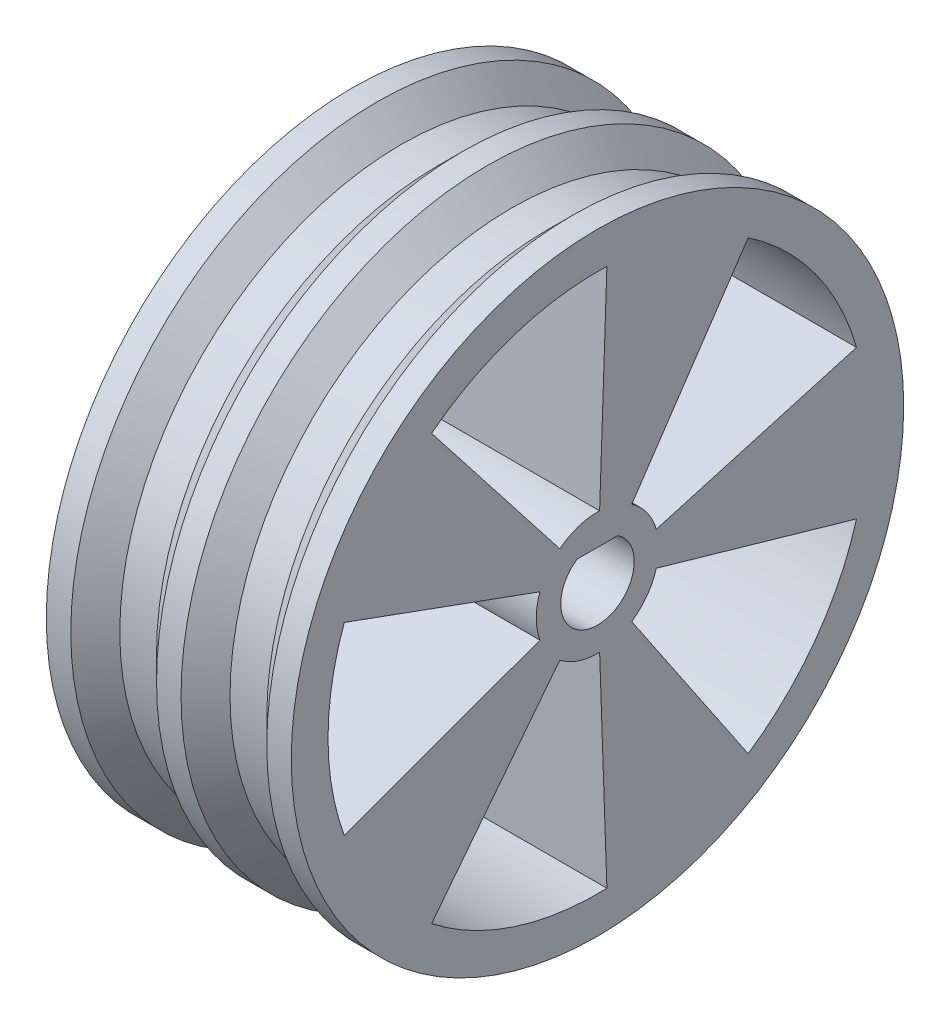
ISO-10303-21;
HEADER;
FILE_DESCRIPTION(('STEP AP214'),'2;1');
FILE_NAME('part.step','',(''),(''),'','','');
FILE_SCHEMA(('AUTOMOTIVE_DESIGN { 1 0 10303 214 1 1 1 1 }'));
ENDSEC;
DATA;
#1=APPLICATION_CONTEXT('core data for automotive mechanical design processes');
#2=APPLICATION_PROTOCOL_DEFINITION('international standard','automotive_design',2000,#1);
#3=PRODUCT_CONTEXT('',#1,'mechanical');
#4=PRODUCT('Part','Part','',(#3));
#5=PRODUCT_RELATED_PRODUCT_CATEGORY('part','',(#4));
#6=PRODUCT_DEFINITION_FORMATION('','',#4);
#7=PRODUCT_DEFINITION_CONTEXT('part definition',#1,'design');
#8=PRODUCT_DEFINITION('design','',#6,#7);
#9=PRODUCT_DEFINITION_SHAPE('','',#8);
#10=(LENGTH_UNIT() NAMED_UNIT(*) SI_UNIT(.MILLI.,.METRE.));
#11=(NAMED_UNIT(*) PLANE_ANGLE_UNIT() SI_UNIT($,.RADIAN.));
#12=(NAMED_UNIT(*) SI_UNIT($,.STERADIAN.) SOLID_ANGLE_UNIT());
#13=UNCERTAINTY_MEASURE_WITH_UNIT(LENGTH_MEASURE(1.E-05),#10,'distance_accuracy_value','');
#14=(GEOMETRIC_REPRESENTATION_CONTEXT(3) GLOBAL_UNCERTAINTY_ASSIGNED_CONTEXT((#13)) GLOBAL_UNIT_ASSIGNED_CONTEXT((#10,
#11,#12)) REPRESENTATION_CONTEXT('',''));
#15=CARTESIAN_POINT('',(0.,0.,0.));
#16=DIRECTION('',(0.,0.,1.));
#17=DIRECTION('',(1.,0.,0.));
#18=AXIS2_PLACEMENT_3D('',#15,#16,#17);
#19=CARTESIAN_POINT('',(-10.,2.5,1.6583123951777));
#20=DIRECTION('',(0.,1.,0.));
#21=DIRECTION('',(0.,0.,1.));
#22=AXIS2_PLACEMENT_3D('',#19,#20,#21);
#23=PLANE('',#22);
#24=DIRECTION('',(0.,0.,1.));
#25=VECTOR('',#24,1.);
#26=CARTESIAN_POINT('',(-6.,2.5,1.6583123951777));
#27=LINE('',#26,#25);
#28=CARTESIAN_POINT('',(-6.,2.5,-1.6583123951777));
#29=VERTEX_POINT('',#28);
#30=CARTESIAN_POINT('',(-6.,2.5,1.6583123951777));
#31=VERTEX_POINT('',#30);
#32=EDGE_CURVE('E227',#29,#31,#27,.T.);
#33=ORIENTED_EDGE('',*,*,#32,.F.);
#34=DIRECTION('',(1.,0.,0.));
#35=VECTOR('',#34,1.);
#36=CARTESIAN_POINT('',(-10.,2.5,-1.6583123951777));
#37=LINE('',#36,#35);
#38=CARTESIAN_POINT('',(10.,2.5,-1.6583123951777));
#39=VERTEX_POINT('',#38);
#40=EDGE_CURVE('E241',#29,#39,#37,.T.);
#41=ORIENTED_EDGE('',*,*,#40,.T.);
#42=DIRECTION('',(0.,0.,1.));
#43=VECTOR('',#42,1.);
#44=CARTESIAN_POINT('',(10.,2.5,1.6583123951777));
#45=LINE('',#44,#43);
#46=CARTESIAN_POINT('',(10.,2.5,1.6583123951777));
#47=VERTEX_POINT('',#46);
#48=EDGE_CURVE('E245',#39,#47,#45,.T.);
#49=ORIENTED_EDGE('',*,*,#48,.T.);
#50=DIRECTION('',(1.,0.,0.));
#51=VECTOR('',#50,1.);
#52=CARTESIAN_POINT('',(-10.,2.5,1.6583123951777));
#53=LINE('',#52,#51);
#54=EDGE_CURVE('E239',#31,#47,#53,.T.);
#55=ORIENTED_EDGE('',*,*,#54,.F.);
#56=EDGE_LOOP('',(#33,#41,#49,#55));
#57=FACE_BOUND('',#56,.T.);
#58=ADVANCED_FACE('F81',(#57),#23,.F.);
#59=CARTESIAN_POINT('',(-10.,0.,0.));
#60=DIRECTION('',(1.,0.,0.));
#61=DIRECTION('',(0.,0.,-1.));
#62=AXIS2_PLACEMENT_3D('',#59,#60,#61);
#63=PLANE('',#62);
#64=CARTESIAN_POINT('',(-10.,0.,0.));
#65=DIRECTION('',(1.,0.,0.));
#66=DIRECTION('',(0.,0.,-1.));
#67=AXIS2_PLACEMENT_3D('',#64,#65,#66);
#68=CIRCLE('',#67,5.);
#69=CARTESIAN_POINT('',(-10.,-4.99695413509548,-0.174497483512452));
#70=VERTEX_POINT('',#69);
#71=CARTESIAN_POINT('',(-10.,-3.94005376803357,3.07830737662834));
#72=VERTEX_POINT('',#71);
#73=EDGE_CURVE('E798',#70,#72,#68,.F.);
#74=ORIENTED_EDGE('',*,*,#73,.T.);
#75=DIRECTION('',(0.,0.788010753606723,-0.615661475325657));
#76=VECTOR('',#75,1.);
#77=CARTESIAN_POINT('',(-10.,0.,0.));
#78=LINE('',#77,#76);
#79=CARTESIAN_POINT('',(-10.,-17.3362365793479,13.5445524571645));
#80=VERTEX_POINT('',#79);
#81=EDGE_CURVE('E779',#80,#72,#78,.T.);
#82=ORIENTED_EDGE('',*,*,#81,.F.);
#83=CARTESIAN_POINT('',(-10.,0.,0.));
#84=DIRECTION('',(1.,0.,0.));
#85=DIRECTION('',(0.,0.,-1.));
#86=AXIS2_PLACEMENT_3D('',#83,#84,#85);
#87=CIRCLE('',#86,22.);
#88=CARTESIAN_POINT('',(-10.,-21.9865981944201,-0.767788927455052));
#89=VERTEX_POINT('',#88);
#90=EDGE_CURVE('E771',#89,#80,#87,.F.);
#91=ORIENTED_EDGE('',*,*,#90,.F.);
#92=DIRECTION('',(0.,0.999390827019096,0.0348994967025059));
#93=VECTOR('',#92,1.);
#94=CARTESIAN_POINT('',(-10.,0.,0.));
#95=LINE('',#94,#93);
#96=EDGE_CURVE('E789',#89,#70,#95,.T.);
#97=ORIENTED_EDGE('',*,*,#96,.T.);
#98=EDGE_LOOP('',(#74,#82,#91,#97));
#99=FACE_BOUND('',#98,.T.);
#100=CARTESIAN_POINT('',(-10.,0.,0.));
#101=DIRECTION('',(1.,0.,0.));
#102=DIRECTION('',(0.,0.,-1.));
#103=AXIS2_PLACEMENT_3D('',#100,#101,#102);
#104=CIRCLE('',#103,5.);
#105=CARTESIAN_POINT('',(-10.,-1.37818677908506,-4.8063084796917));
#106=VERTEX_POINT('',#105);
#107=CARTESIAN_POINT('',(-10.,-4.14518786277518,-2.79596451735377));
#108=VERTEX_POINT('',#107);
#109=EDGE_CURVE('E773',#106,#108,#104,.F.);
#110=ORIENTED_EDGE('',*,*,#109,.T.);
#111=DIRECTION('',(0.,0.829037572555044,0.559192903470743));
#112=VECTOR('',#111,1.);
#113=CARTESIAN_POINT('',(-10.,0.,0.));
#114=LINE('',#113,#112);
#115=CARTESIAN_POINT('',(-10.,-18.2388265962109,-12.3022438763564));
#116=VERTEX_POINT('',#115);
#117=EDGE_CURVE('E751',#116,#108,#114,.T.);
#118=ORIENTED_EDGE('',*,*,#117,.F.);
#119=CARTESIAN_POINT('',(-10.,0.,0.));
#120=DIRECTION('',(1.,0.,0.));
#121=DIRECTION('',(0.,0.,-1.));
#122=AXIS2_PLACEMENT_3D('',#119,#120,#121);
#123=CIRCLE('',#122,22.);
#124=CARTESIAN_POINT('',(-10.,-6.06402182797396,-21.147757310643));
#125=VERTEX_POINT('',#124);
#126=EDGE_CURVE('E743',#125,#116,#123,.F.);
#127=ORIENTED_EDGE('',*,*,#126,.F.);
#128=DIRECTION('',(0.,0.275637355816996,0.96126169593832));
#129=VECTOR('',#128,1.);
#130=CARTESIAN_POINT('',(-10.,0.,0.));
#131=LINE('',#130,#129);
#132=EDGE_CURVE('E762',#125,#106,#131,.T.);
#133=ORIENTED_EDGE('',*,*,#132,.T.);
#134=EDGE_LOOP('',(#110,#118,#127,#133));
#135=FACE_BOUND('',#134,.T.);
#136=CARTESIAN_POINT('',(-10.,0.,0.));
#137=DIRECTION('',(1.,0.,0.));
#138=DIRECTION('',(0.,0.,-1.));
#139=AXIS2_PLACEMENT_3D('',#136,#137,#138);
#140=CIRCLE('',#139,5.);
#141=CARTESIAN_POINT('',(-10.,4.14518786277522,-2.79596451735385));
#142=VERTEX_POINT('',#141);
#143=CARTESIAN_POINT('',(-10.,1.37818677908497,-4.8063084796916));
#144=VERTEX_POINT('',#143);
#145=EDGE_CURVE('E745',#142,#144,#140,.F.);
#146=ORIENTED_EDGE('',*,*,#145,.T.);
#147=DIRECTION('',(0.,-0.275637355816999,0.961261695938319));
#148=VECTOR('',#147,1.);
#149=CARTESIAN_POINT('',(-10.,0.,0.));
#150=LINE('',#149,#148);
#151=CARTESIAN_POINT('',(-10.,6.06402182797396,-21.147757310643));
#152=VERTEX_POINT('',#151);
#153=EDGE_CURVE('E723',#152,#144,#150,.T.);
#154=ORIENTED_EDGE('',*,*,#153,.F.);
#155=CARTESIAN_POINT('',(-10.,0.,0.));
#156=DIRECTION('',(1.,0.,0.));
#157=DIRECTION('',(0.,0.,-1.));
#158=AXIS2_PLACEMENT_3D('',#155,#156,#157);
#159=CIRCLE('',#158,22.);
#160=CARTESIAN_POINT('',(-10.,18.2388265962109,-12.3022438763564));
#161=VERTEX_POINT('',#160);
#162=EDGE_CURVE('E698',#161,#152,#159,.F.);
#163=ORIENTED_EDGE('',*,*,#162,.F.);
#164=DIRECTION('',(0.,-0.829037572555046,0.559192903470741));
#165=VECTOR('',#164,1.);
#166=CARTESIAN_POINT('',(-10.,0.,-1.04985018589199E-13));
#167=LINE('',#166,#165);
#168=EDGE_CURVE('E734',#161,#142,#167,.T.);
#169=ORIENTED_EDGE('',*,*,#168,.T.);
#170=EDGE_LOOP('',(#146,#154,#163,#169));
#171=FACE_BOUND('',#170,.T.);
#172=CARTESIAN_POINT('',(-10.,0.,0.));
#173=DIRECTION('',(1.,0.,0.));
#174=DIRECTION('',(0.,0.,-1.));
#175=AXIS2_PLACEMENT_3D('',#172,#173,#174);
#176=CIRCLE('',#175,5.);
#177=CARTESIAN_POINT('',(-10.,3.9400537680336,3.0783073766283));
#178=VERTEX_POINT('',#177);
#179=CARTESIAN_POINT('',(-10.,4.99695413509548,-0.174497483512522));
#180=VERTEX_POINT('',#179);
#181=EDGE_CURVE('E687',#178,#180,#176,.F.);
#182=ORIENTED_EDGE('',*,*,#181,.T.);
#183=DIRECTION('',(0.,-0.999390827019096,0.0348994967025015));
#184=VECTOR('',#183,1.);
#185=CARTESIAN_POINT('',(-10.,0.,0.));
#186=LINE('',#185,#184);
#187=CARTESIAN_POINT('',(-10.,21.9865981944201,-0.767788927455048));
#188=VERTEX_POINT('',#187);
#189=EDGE_CURVE('E683',#188,#180,#186,.T.);
#190=ORIENTED_EDGE('',*,*,#189,.F.);
#191=CARTESIAN_POINT('',(-10.,0.,0.));
#192=DIRECTION('',(1.,0.,0.));
#193=DIRECTION('',(0.,0.,-1.));
#194=AXIS2_PLACEMENT_3D('',#191,#192,#193);
#195=CIRCLE('',#194,22.);
#196=CARTESIAN_POINT('',(-10.,17.3362365793479,13.5445524571645));
#197=VERTEX_POINT('',#196);
#198=EDGE_CURVE('E680',#197,#188,#195,.F.);
#199=ORIENTED_EDGE('',*,*,#198,.F.);
#200=DIRECTION('',(0.,-0.788010753606721,-0.615661475325659));
#201=VECTOR('',#200,1.);
#202=CARTESIAN_POINT('',(-10.,0.,0.));
#203=LINE('',#202,#201);
#204=EDGE_CURVE('E692',#197,#178,#203,.T.);
#205=ORIENTED_EDGE('',*,*,#204,.T.);
#206=EDGE_LOOP('',(#182,#190,#199,#205));
#207=FACE_BOUND('',#206,.T.);
#208=CARTESIAN_POINT('',(-10.,0.,0.));
#209=DIRECTION('',(1.,0.,0.));
#210=DIRECTION('',(0.,0.,-1.));
#211=AXIS2_PLACEMENT_3D('',#208,#209,#210);
#212=CIRCLE('',#211,25.);
#213=CARTESIAN_POINT('',(-10.,0.,-25.));
#214=VERTEX_POINT('',#213);
#215=EDGE_CURVE('E233',#214,#214,#212,.T.);
#216=ORIENTED_EDGE('',*,*,#215,.F.);
#217=EDGE_LOOP('',(#216));
#218=FACE_BOUND('',#217,.T.);
#219=CARTESIAN_POINT('',(-10.,0.,0.));
#220=DIRECTION('',(1.,0.,0.));
#221=DIRECTION('',(0.,0.,-1.));
#222=AXIS2_PLACEMENT_3D('',#219,#220,#221);
#223=CIRCLE('',#222,3.);
#224=CARTESIAN_POINT('',(-10.,0.,-3.));
#225=VERTEX_POINT('',#224);
#226=EDGE_CURVE('E250',#225,#225,#223,.T.);
#227=ORIENTED_EDGE('',*,*,#226,.T.);
#228=EDGE_LOOP('',(#227));
#229=FACE_BOUND('',#228,.T.);
#230=DIRECTION('',(0.,0.34202014332567,-0.939692620785908));
#231=VECTOR('',#230,1.);
#232=CARTESIAN_POINT('',(-10.,0.,0.));
#233=LINE('',#232,#231);
#234=CARTESIAN_POINT('',(-10.,-7.52444315316474,20.67323765729));
#235=VERTEX_POINT('',#234);
#236=CARTESIAN_POINT('',(-10.,-1.71010071662835,4.69846310392954));
#237=VERTEX_POINT('',#236);
#238=EDGE_CURVE('E645',#235,#237,#233,.T.);
#239=ORIENTED_EDGE('',*,*,#238,.T.);
#240=CARTESIAN_POINT('',(-10.,0.,0.));
#241=DIRECTION('',(1.,0.,0.));
#242=DIRECTION('',(0.,0.,-1.));
#243=AXIS2_PLACEMENT_3D('',#240,#241,#242);
#244=CIRCLE('',#243,5.);
#245=CARTESIAN_POINT('',(-10.,1.71010071662835,4.69846310392954));
#246=VERTEX_POINT('',#245);
#247=EDGE_CURVE('E653',#237,#246,#244,.F.);
#248=ORIENTED_EDGE('',*,*,#247,.T.);
#249=DIRECTION('',(0.,-0.34202014332567,-0.939692620785908));
#250=VECTOR('',#249,1.);
#251=CARTESIAN_POINT('',(-10.,0.,0.));
#252=LINE('',#251,#250);
#253=CARTESIAN_POINT('',(-10.,7.52444315316474,20.67323765729));
#254=VERTEX_POINT('',#253);
#255=EDGE_CURVE('E676',#254,#246,#252,.T.);
#256=ORIENTED_EDGE('',*,*,#255,.F.);
#257=CARTESIAN_POINT('',(-10.,0.,0.));
#258=DIRECTION('',(1.,0.,0.));
#259=DIRECTION('',(0.,0.,-1.));
#260=AXIS2_PLACEMENT_3D('',#257,#258,#259);
#261=CIRCLE('',#260,22.);
#262=EDGE_CURVE('E660',#235,#254,#261,.F.);
#263=ORIENTED_EDGE('',*,*,#262,.F.);
#264=EDGE_LOOP('',(#239,#248,#256,#263));
#265=FACE_BOUND('',#264,.T.);
#266=ADVANCED_FACE('F274',(#99,#135,#171,#207,#218,#229,#265),#63,.F.);
#267=CARTESIAN_POINT('',(10.,0.,0.));
#268=DIRECTION('',(1.,0.,0.));
#269=DIRECTION('',(0.,0.,-1.));
#270=AXIS2_PLACEMENT_3D('',#267,#268,#269);
#271=PLANE('',#270);
#272=DIRECTION('',(0.,-0.788010753606723,0.615661475325657));
#273=VECTOR('',#272,1.);
#274=CARTESIAN_POINT('',(10.,0.,0.));
#275=LINE('',#274,#273);
#276=CARTESIAN_POINT('',(10.,-3.94005376803357,3.07830737662834));
#277=VERTEX_POINT('',#276);
#278=CARTESIAN_POINT('',(10.,-17.3362365793479,13.5445524571645));
#279=VERTEX_POINT('',#278);
#280=EDGE_CURVE('E242',#277,#279,#275,.T.);
#281=ORIENTED_EDGE('',*,*,#280,.F.);
#282=CARTESIAN_POINT('',(10.,0.,0.));
#283=DIRECTION('',(1.,0.,0.));
#284=DIRECTION('',(0.,0.,-1.));
#285=AXIS2_PLACEMENT_3D('',#282,#283,#284);
#286=CIRCLE('',#285,5.);
#287=CARTESIAN_POINT('',(10.,-4.99695413509548,-0.174497483512452));
#288=VERTEX_POINT('',#287);
#289=EDGE_CURVE('E783',#277,#288,#286,.T.);
#290=ORIENTED_EDGE('',*,*,#289,.T.);
#291=DIRECTION('',(0.,-0.999390827019096,-0.0348994967025059));
#292=VECTOR('',#291,1.);
#293=CARTESIAN_POINT('',(10.,0.,0.));
#294=LINE('',#293,#292);
#295=CARTESIAN_POINT('',(10.,-21.9865981944201,-0.767788927455052));
#296=VERTEX_POINT('',#295);
#297=EDGE_CURVE('E791',#288,#296,#294,.T.);
#298=ORIENTED_EDGE('',*,*,#297,.T.);
#299=CARTESIAN_POINT('',(10.,0.,0.));
#300=DIRECTION('',(1.,0.,0.));
#301=DIRECTION('',(0.,0.,-1.));
#302=AXIS2_PLACEMENT_3D('',#299,#300,#301);
#303=CIRCLE('',#302,22.);
#304=EDGE_CURVE('E794',#279,#296,#303,.T.);
#305=ORIENTED_EDGE('',*,*,#304,.F.);
#306=EDGE_LOOP('',(#281,#290,#298,#305));
#307=FACE_BOUND('',#306,.T.);
#308=DIRECTION('',(0.,-0.829037572555044,-0.559192903470743));
#309=VECTOR('',#308,1.);
#310=CARTESIAN_POINT('',(10.,0.,0.));
#311=LINE('',#310,#309);
#312=CARTESIAN_POINT('',(10.,-4.14518786277528,-2.79596451735384));
#313=VERTEX_POINT('',#312);
#314=CARTESIAN_POINT('',(10.,-18.2388265962109,-12.3022438763564));
#315=VERTEX_POINT('',#314);
#316=EDGE_CURVE('E609',#313,#315,#311,.T.);
#317=ORIENTED_EDGE('',*,*,#316,.F.);
#318=CARTESIAN_POINT('',(10.,0.,0.));
#319=DIRECTION('',(1.,0.,0.));
#320=DIRECTION('',(0.,0.,-1.));
#321=AXIS2_PLACEMENT_3D('',#318,#319,#320);
#322=CIRCLE('',#321,5.);
#323=CARTESIAN_POINT('',(10.,-1.37818677908506,-4.8063084796917));
#324=VERTEX_POINT('',#323);
#325=EDGE_CURVE('E756',#313,#324,#322,.T.);
#326=ORIENTED_EDGE('',*,*,#325,.T.);
#327=DIRECTION('',(0.,-0.275637355816996,-0.96126169593832));
#328=VECTOR('',#327,1.);
#329=CARTESIAN_POINT('',(10.,0.,0.));
#330=LINE('',#329,#328);
#331=CARTESIAN_POINT('',(10.,-6.06402182797396,-21.147757310643));
#332=VERTEX_POINT('',#331);
#333=EDGE_CURVE('E764',#324,#332,#330,.T.);
#334=ORIENTED_EDGE('',*,*,#333,.T.);
#335=CARTESIAN_POINT('',(10.,0.,0.));
#336=DIRECTION('',(1.,0.,0.));
#337=DIRECTION('',(0.,0.,-1.));
#338=AXIS2_PLACEMENT_3D('',#335,#336,#337);
#339=CIRCLE('',#338,22.);
#340=EDGE_CURVE('E767',#315,#332,#339,.T.);
#341=ORIENTED_EDGE('',*,*,#340,.F.);
#342=EDGE_LOOP('',(#317,#326,#334,#341));
#343=FACE_BOUND('',#342,.T.);
#344=DIRECTION('',(0.,0.275637355816999,-0.961261695938319));
#345=VECTOR('',#344,1.);
#346=CARTESIAN_POINT('',(10.,0.,0.));
#347=LINE('',#346,#345);
#348=CARTESIAN_POINT('',(10.,1.378186779085,-4.80630847969172));
#349=VERTEX_POINT('',#348);
#350=CARTESIAN_POINT('',(10.,6.06402182797396,-21.147757310643));
#351=VERTEX_POINT('',#350);
#352=EDGE_CURVE('E614',#349,#351,#347,.T.);
#353=ORIENTED_EDGE('',*,*,#352,.F.);
#354=CARTESIAN_POINT('',(10.,0.,0.));
#355=DIRECTION('',(1.,0.,0.));
#356=DIRECTION('',(0.,0.,-1.));
#357=AXIS2_PLACEMENT_3D('',#354,#355,#356);
#358=CIRCLE('',#357,5.);
#359=CARTESIAN_POINT('',(10.,4.14518786277522,-2.79596451735385));
#360=VERTEX_POINT('',#359);
#361=EDGE_CURVE('E728',#349,#360,#358,.T.);
#362=ORIENTED_EDGE('',*,*,#361,.T.);
#363=DIRECTION('',(0.,0.829037572555046,-0.559192903470741));
#364=VECTOR('',#363,1.);
#365=CARTESIAN_POINT('',(10.,0.,-1.04985018589199E-13));
#366=LINE('',#365,#364);
#367=CARTESIAN_POINT('',(10.,18.2388265962109,-12.3022438763564));
#368=VERTEX_POINT('',#367);
#369=EDGE_CURVE('E736',#360,#368,#366,.T.);
#370=ORIENTED_EDGE('',*,*,#369,.T.);
#371=CARTESIAN_POINT('',(10.,0.,0.));
#372=DIRECTION('',(1.,0.,0.));
#373=DIRECTION('',(0.,0.,-1.));
#374=AXIS2_PLACEMENT_3D('',#371,#372,#373);
#375=CIRCLE('',#374,22.);
#376=EDGE_CURVE('E739',#351,#368,#375,.T.);
#377=ORIENTED_EDGE('',*,*,#376,.F.);
#378=EDGE_LOOP('',(#353,#362,#370,#377));
#379=FACE_BOUND('',#378,.T.);
#380=DIRECTION('',(0.,0.999390827019096,-0.0348994967025015));
#381=VECTOR('',#380,1.);
#382=CARTESIAN_POINT('',(10.,0.,0.));
#383=LINE('',#382,#381);
#384=CARTESIAN_POINT('',(10.,4.99695413509548,-0.174497483512522));
#385=VERTEX_POINT('',#384);
#386=CARTESIAN_POINT('',(10.,21.9865981944201,-0.767788927455049));
#387=VERTEX_POINT('',#386);
#388=EDGE_CURVE('E619',#385,#387,#383,.T.);
#389=ORIENTED_EDGE('',*,*,#388,.F.);
#390=CARTESIAN_POINT('',(10.,0.,0.));
#391=DIRECTION('',(1.,0.,0.));
#392=DIRECTION('',(0.,0.,-1.));
#393=AXIS2_PLACEMENT_3D('',#390,#391,#392);
#394=CIRCLE('',#393,5.);
#395=CARTESIAN_POINT('',(10.,3.9400537680336,3.0783073766283));
#396=VERTEX_POINT('',#395);
#397=EDGE_CURVE('E704',#385,#396,#394,.T.);
#398=ORIENTED_EDGE('',*,*,#397,.T.);
#399=DIRECTION('',(0.,0.788010753606721,0.615661475325659));
#400=VECTOR('',#399,1.);
#401=CARTESIAN_POINT('',(10.,0.,0.));
#402=LINE('',#401,#400);
#403=CARTESIAN_POINT('',(10.,17.3362365793479,13.5445524571645));
#404=VERTEX_POINT('',#403);
#405=EDGE_CURVE('E701',#396,#404,#402,.T.);
#406=ORIENTED_EDGE('',*,*,#405,.T.);
#407=CARTESIAN_POINT('',(10.,0.,0.));
#408=DIRECTION('',(1.,0.,0.));
#409=DIRECTION('',(0.,0.,-1.));
#410=AXIS2_PLACEMENT_3D('',#407,#408,#409);
#411=CIRCLE('',#410,22.);
#412=EDGE_CURVE('E697',#387,#404,#411,.T.);
#413=ORIENTED_EDGE('',*,*,#412,.F.);
#414=EDGE_LOOP('',(#389,#398,#406,#413));
#415=FACE_BOUND('',#414,.T.);
#416=ORIENTED_EDGE('',*,*,#48,.F.);
#417=CARTESIAN_POINT('',(10.,0.,0.));
#418=DIRECTION('',(1.,0.,0.));
#419=DIRECTION('',(0.,0.,-1.));
#420=AXIS2_PLACEMENT_3D('',#417,#418,#419);
#421=CIRCLE('',#420,3.);
#422=EDGE_CURVE('E662',#47,#39,#421,.T.);
#423=ORIENTED_EDGE('',*,*,#422,.F.);
#424=EDGE_LOOP('',(#416,#423));
#425=FACE_BOUND('',#424,.T.);
#426=CARTESIAN_POINT('',(10.,0.,0.));
#427=DIRECTION('',(1.,0.,0.));
#428=DIRECTION('',(0.,0.,-1.));
#429=AXIS2_PLACEMENT_3D('',#426,#427,#428);
#430=CIRCLE('',#429,25.);
#431=CARTESIAN_POINT('',(10.,0.,-25.));
#432=VERTEX_POINT('',#431);
#433=EDGE_CURVE('E624',#432,#432,#430,.T.);
#434=ORIENTED_EDGE('',*,*,#433,.T.);
#435=EDGE_LOOP('',(#434));
#436=FACE_BOUND('',#435,.T.);
#437=CARTESIAN_POINT('',(10.,0.,0.));
#438=DIRECTION('',(1.,0.,0.));
#439=DIRECTION('',(0.,0.,-1.));
#440=AXIS2_PLACEMENT_3D('',#437,#438,#439);
#441=CIRCLE('',#440,5.);
#442=CARTESIAN_POINT('',(10.,1.71010071662835,4.69846310392954));
#443=VERTEX_POINT('',#442);
#444=CARTESIAN_POINT('',(10.,-1.71010071662835,4.69846310392954));
#445=VERTEX_POINT('',#444);
#446=EDGE_CURVE('E629',#443,#445,#441,.T.);
#447=ORIENTED_EDGE('',*,*,#446,.T.);
#448=DIRECTION('',(0.,-0.34202014332567,0.939692620785908));
#449=VECTOR('',#448,1.);
#450=CARTESIAN_POINT('',(10.,0.,0.));
#451=LINE('',#450,#449);
#452=CARTESIAN_POINT('',(10.,-7.52444315316474,20.67323765729));
#453=VERTEX_POINT('',#452);
#454=EDGE_CURVE('E632',#445,#453,#451,.T.);
#455=ORIENTED_EDGE('',*,*,#454,.T.);
#456=CARTESIAN_POINT('',(10.,0.,0.));
#457=DIRECTION('',(1.,0.,0.));
#458=DIRECTION('',(0.,0.,-1.));
#459=AXIS2_PLACEMENT_3D('',#456,#457,#458);
#460=CIRCLE('',#459,22.);
#461=CARTESIAN_POINT('',(10.,7.52444315316474,20.67323765729));
#462=VERTEX_POINT('',#461);
#463=EDGE_CURVE('E638',#462,#453,#460,.T.);
#464=ORIENTED_EDGE('',*,*,#463,.F.);
#465=DIRECTION('',(0.,0.34202014332567,0.939692620785908));
#466=VECTOR('',#465,1.);
#467=CARTESIAN_POINT('',(10.,0.,0.));
#468=LINE('',#467,#466);
#469=EDGE_CURVE('E633',#443,#462,#468,.T.);
#470=ORIENTED_EDGE('',*,*,#469,.F.);
#471=EDGE_LOOP('',(#447,#455,#464,#470));
#472=FACE_BOUND('',#471,.T.);
#473=ADVANCED_FACE('F279',(#307,#343,#379,#415,#425,#436,#472),#271,.T.);
#474=CARTESIAN_POINT('',(-10.,0.,0.));
#475=DIRECTION('',(1.,0.,0.));
#476=DIRECTION('',(0.,0.,-1.));
#477=AXIS2_PLACEMENT_3D('',#474,#475,#476);
#478=CYLINDRICAL_SURFACE('',#477,25.);
#479=CARTESIAN_POINT('',(-1.,0.,0.));
#480=DIRECTION('',(-1.,0.,0.));
#481=DIRECTION('',(0.,0.,1.));
#482=AXIS2_PLACEMENT_3D('',#479,#480,#481);
#483=CIRCLE('',#482,25.);
#484=CARTESIAN_POINT('',(-1.,0.,25.));
#485=VERTEX_POINT('',#484);
#486=EDGE_CURVE('E305',#485,#485,#483,.T.);
#487=ORIENTED_EDGE('',*,*,#486,.F.);
#488=EDGE_LOOP('',(#487));
#489=FACE_BOUND('',#488,.T.);
#490=CARTESIAN_POINT('',(1.,0.,0.));
#491=DIRECTION('',(-1.,0.,0.));
#492=DIRECTION('',(0.,0.,1.));
#493=AXIS2_PLACEMENT_3D('',#490,#491,#492);
#494=CIRCLE('',#493,25.);
#495=CARTESIAN_POINT('',(1.,0.,25.));
#496=VERTEX_POINT('',#495);
#497=EDGE_CURVE('E654',#496,#496,#494,.T.);
#498=ORIENTED_EDGE('',*,*,#497,.T.);
#499=EDGE_LOOP('',(#498));
#500=FACE_BOUND('',#499,.T.);
#501=ADVANCED_FACE('F293',(#489,#500),#478,.T.);
#502=CARTESIAN_POINT('',(8.,0.,0.));
#503=DIRECTION('',(-1.,0.,0.));
#504=DIRECTION('',(0.,0.,1.));
#505=AXIS2_PLACEMENT_3D('',#502,#503,#504);
#506=CIRCLE('',#505,25.);
#507=CARTESIAN_POINT('',(8.,0.,25.));
#508=VERTEX_POINT('',#507);
#509=EDGE_CURVE('E658',#508,#508,#506,.T.);
#510=ORIENTED_EDGE('',*,*,#509,.F.);
#511=EDGE_LOOP('',(#510));
#512=FACE_BOUND('',#511,.T.);
#513=ORIENTED_EDGE('',*,*,#433,.F.);
#514=EDGE_LOOP('',(#513));
#515=FACE_BOUND('',#514,.T.);
#516=ADVANCED_FACE('F291',(#512,#515),#478,.T.);
#517=CARTESIAN_POINT('',(-8.,0.,0.));
#518=DIRECTION('',(-1.,0.,0.));
#519=DIRECTION('',(0.,0.,1.));
#520=AXIS2_PLACEMENT_3D('',#517,#518,#519);
#521=CIRCLE('',#520,25.);
#522=CARTESIAN_POINT('',(-8.,0.,25.));
#523=VERTEX_POINT('',#522);
#524=EDGE_CURVE('E657',#523,#523,#521,.T.);
#525=ORIENTED_EDGE('',*,*,#524,.T.);
#526=EDGE_LOOP('',(#525));
#527=FACE_BOUND('',#526,.T.);
#528=ORIENTED_EDGE('',*,*,#215,.T.);
#529=EDGE_LOOP('',(#528));
#530=FACE_BOUND('',#529,.T.);
#531=ADVANCED_FACE('F287',(#527,#530),#478,.T.);
#532=CARTESIAN_POINT('',(-10.,0.,0.));
#533=DIRECTION('',(1.,0.,0.));
#534=DIRECTION('',(0.,0.,-1.));
#535=AXIS2_PLACEMENT_3D('',#532,#533,#534);
#536=CYLINDRICAL_SURFACE('',#535,3.);
#537=CARTESIAN_POINT('',(-6.,0.,0.));
#538=DIRECTION('',(-1.,0.,0.));
#539=DIRECTION('',(0.,0.,1.));
#540=AXIS2_PLACEMENT_3D('',#537,#538,#539);
#541=CIRCLE('',#540,3.);
#542=EDGE_CURVE('E95',#31,#29,#541,.T.);
#543=ORIENTED_EDGE('',*,*,#542,.F.);
#544=ORIENTED_EDGE('',*,*,#54,.T.);
#545=ORIENTED_EDGE('',*,*,#422,.T.);
#546=ORIENTED_EDGE('',*,*,#40,.F.);
#547=EDGE_LOOP('',(#543,#544,#545,#546));
#548=FACE_BOUND('',#547,.T.);
#549=ORIENTED_EDGE('',*,*,#226,.F.);
#550=EDGE_LOOP('',(#549));
#551=FACE_BOUND('',#550,.T.);
#552=ADVANCED_FACE('F236',(#548,#551),#536,.F.);
#553=CARTESIAN_POINT('',(-1.,0.,0.));
#554=DIRECTION('',(-1.,0.,0.));
#555=DIRECTION('',(0.,0.,1.));
#556=AXIS2_PLACEMENT_3D('',#553,#554,#555);
#557=CYLINDRICAL_SURFACE('',#556,23.);
#558=CARTESIAN_POINT('',(-6.00000000000001,0.,0.));
#559=DIRECTION('',(-1.,0.,0.));
#560=DIRECTION('',(0.,0.,1.));
#561=AXIS2_PLACEMENT_3D('',#558,#559,#560);
#562=CIRCLE('',#561,23.);
#563=CARTESIAN_POINT('',(-6.00000000000001,0.,23.));
#564=VERTEX_POINT('',#563);
#565=EDGE_CURVE('E257',#564,#564,#562,.F.);
#566=ORIENTED_EDGE('',*,*,#565,.T.);
#567=EDGE_LOOP('',(#566));
#568=FACE_BOUND('',#567,.T.);
#569=CARTESIAN_POINT('',(-3.00000000000002,0.,0.));
#570=DIRECTION('',(-1.,0.,0.));
#571=DIRECTION('',(0.,0.,1.));
#572=AXIS2_PLACEMENT_3D('',#569,#570,#571);
#573=CIRCLE('',#572,23.);
#574=CARTESIAN_POINT('',(-3.00000000000002,0.,23.));
#575=VERTEX_POINT('',#574);
#576=EDGE_CURVE('E232',#575,#575,#573,.T.);
#577=ORIENTED_EDGE('',*,*,#576,.T.);
#578=EDGE_LOOP('',(#577));
#579=FACE_BOUND('',#578,.T.);
#580=ADVANCED_FACE('F286',(#568,#579),#557,.T.);
#581=CARTESIAN_POINT('',(1.,0.,0.));
#582=DIRECTION('',(1.,0.,0.));
#583=DIRECTION('',(0.,0.,-1.));
#584=AXIS2_PLACEMENT_3D('',#581,#582,#583);
#585=CYLINDRICAL_SURFACE('',#584,23.);
#586=CARTESIAN_POINT('',(2.99999999999999,0.,0.));
#587=DIRECTION('',(1.,0.,0.));
#588=DIRECTION('',(0.,0.,-1.));
#589=AXIS2_PLACEMENT_3D('',#586,#587,#588);
#590=CIRCLE('',#589,23.);
#591=CARTESIAN_POINT('',(2.99999999999999,0.,-23.));
#592=VERTEX_POINT('',#591);
#593=EDGE_CURVE('E12',#592,#592,#590,.T.);
#594=ORIENTED_EDGE('',*,*,#593,.T.);
#595=EDGE_LOOP('',(#594));
#596=FACE_BOUND('',#595,.T.);
#597=CARTESIAN_POINT('',(5.99999999999999,0.,0.));
#598=DIRECTION('',(1.,0.,0.));
#599=DIRECTION('',(0.,0.,-1.));
#600=AXIS2_PLACEMENT_3D('',#597,#598,#599);
#601=CIRCLE('',#600,23.);
#602=CARTESIAN_POINT('',(5.99999999999999,0.,-23.));
#603=VERTEX_POINT('',#602);
#604=EDGE_CURVE('E89',#603,#603,#601,.F.);
#605=ORIENTED_EDGE('',*,*,#604,.T.);
#606=EDGE_LOOP('',(#605));
#607=FACE_BOUND('',#606,.T.);
#608=ADVANCED_FACE('F262',(#596,#607),#585,.T.);
#609=CARTESIAN_POINT('',(-34.9212654929615,0.,0.));
#610=DIRECTION('',(0.,0.939692620785908,0.34202014332567));
#611=DIRECTION('',(0.,-0.34202014332567,0.939692620785908));
#612=AXIS2_PLACEMENT_3D('',#609,#610,#611);
#613=PLANE('',#612);
#614=DIRECTION('',(1.,0.,0.));
#615=VECTOR('',#614,1.);
#616=CARTESIAN_POINT('',(-34.9212654929615,-7.52444315316474,20.67323765729));
#617=LINE('',#616,#615);
#618=EDGE_CURVE('E636',#235,#453,#617,.T.);
#619=ORIENTED_EDGE('',*,*,#618,.T.);
#620=ORIENTED_EDGE('',*,*,#454,.F.);
#621=DIRECTION('',(1.,0.,0.));
#622=VECTOR('',#621,1.);
#623=CARTESIAN_POINT('',(-34.9212654929615,-1.71010071662835,4.69846310392954));
#624=LINE('',#623,#622);
#625=EDGE_CURVE('E648',#237,#445,#624,.T.);
#626=ORIENTED_EDGE('',*,*,#625,.F.);
#627=ORIENTED_EDGE('',*,*,#238,.F.);
#628=EDGE_LOOP('',(#619,#620,#626,#627));
#629=FACE_BOUND('',#628,.T.);
#630=ADVANCED_FACE('F313',(#629),#613,.T.);
#631=CARTESIAN_POINT('',(-34.9212654929615,0.,0.));
#632=DIRECTION('',(1.,0.,0.));
#633=DIRECTION('',(0.,0.,-1.));
#634=AXIS2_PLACEMENT_3D('',#631,#632,#633);
#635=CYLINDRICAL_SURFACE('',#634,5.);
#636=ORIENTED_EDGE('',*,*,#625,.T.);
#637=ORIENTED_EDGE('',*,*,#446,.F.);
#638=DIRECTION('',(1.,0.,0.));
#639=VECTOR('',#638,1.);
#640=CARTESIAN_POINT('',(-34.9212654929615,1.71010071662835,4.69846310392954));
#641=LINE('',#640,#639);
#642=EDGE_CURVE('E646',#246,#443,#641,.T.);
#643=ORIENTED_EDGE('',*,*,#642,.F.);
#644=ORIENTED_EDGE('',*,*,#247,.F.);
#645=EDGE_LOOP('',(#636,#637,#643,#644));
#646=FACE_BOUND('',#645,.T.);
#647=ADVANCED_FACE('F325',(#646),#635,.T.);
#648=CARTESIAN_POINT('',(-34.9212654929615,0.,0.));
#649=DIRECTION('',(0.,0.939692620785908,-0.34202014332567));
#650=DIRECTION('',(0.,0.34202014332567,0.939692620785908));
#651=AXIS2_PLACEMENT_3D('',#648,#649,#650);
#652=PLANE('',#651);
#653=ORIENTED_EDGE('',*,*,#255,.T.);
#654=ORIENTED_EDGE('',*,*,#642,.T.);
#655=ORIENTED_EDGE('',*,*,#469,.T.);
#656=DIRECTION('',(1.,0.,0.));
#657=VECTOR('',#656,1.);
#658=CARTESIAN_POINT('',(-34.9212654929615,7.52444315316474,20.67323765729));
#659=LINE('',#658,#657);
#660=EDGE_CURVE('E642',#254,#462,#659,.T.);
#661=ORIENTED_EDGE('',*,*,#660,.F.);
#662=EDGE_LOOP('',(#653,#654,#655,#661));
#663=FACE_BOUND('',#662,.T.);
#664=ADVANCED_FACE('F321',(#663),#652,.F.);
#665=CARTESIAN_POINT('',(-34.9212654929615,0.,0.));
#666=DIRECTION('',(1.,0.,0.));
#667=DIRECTION('',(0.,0.,-1.));
#668=AXIS2_PLACEMENT_3D('',#665,#666,#667);
#669=CYLINDRICAL_SURFACE('',#668,22.);
#670=ORIENTED_EDGE('',*,*,#262,.T.);
#671=ORIENTED_EDGE('',*,*,#660,.T.);
#672=ORIENTED_EDGE('',*,*,#463,.T.);
#673=ORIENTED_EDGE('',*,*,#618,.F.);
#674=EDGE_LOOP('',(#670,#671,#672,#673));
#675=FACE_BOUND('',#674,.T.);
#676=ADVANCED_FACE('F317',(#675),#669,.F.);
#677=CARTESIAN_POINT('',(-34.9212654929615,0.,0.));
#678=DIRECTION('',(0.,-0.0348994967025015,-0.999390827019096));
#679=DIRECTION('',(0.,0.999390827019096,-0.0348994967025015));
#680=AXIS2_PLACEMENT_3D('',#677,#678,#679);
#681=PLANE('',#680);
#682=ORIENTED_EDGE('',*,*,#189,.T.);
#683=DIRECTION('',(1.,0.,0.));
#684=VECTOR('',#683,1.);
#685=CARTESIAN_POINT('',(-34.9212654929615,4.99695413509548,-0.174497483512522));
#686=LINE('',#685,#684);
#687=EDGE_CURVE('E707',#180,#385,#686,.T.);
#688=ORIENTED_EDGE('',*,*,#687,.T.);
#689=ORIENTED_EDGE('',*,*,#388,.T.);
#690=DIRECTION('',(1.,0.,0.));
#691=VECTOR('',#690,1.);
#692=CARTESIAN_POINT('',(-34.9212654929615,21.9865981944201,-0.767788927455049));
#693=LINE('',#692,#691);
#694=EDGE_CURVE('E706',#188,#387,#693,.T.);
#695=ORIENTED_EDGE('',*,*,#694,.F.);
#696=EDGE_LOOP('',(#682,#688,#689,#695));
#697=FACE_BOUND('',#696,.T.);
#698=ADVANCED_FACE('F320',(#697),#681,.F.);
#699=CARTESIAN_POINT('',(-34.9212654929615,0.,0.));
#700=DIRECTION('',(1.,0.,0.));
#701=DIRECTION('',(0.,0.,-1.));
#702=AXIS2_PLACEMENT_3D('',#699,#700,#701);
#703=CYLINDRICAL_SURFACE('',#702,5.);
#704=DIRECTION('',(1.,0.,0.));
#705=VECTOR('',#704,1.);
#706=CARTESIAN_POINT('',(-34.9212654929615,3.9400537680336,3.0783073766283));
#707=LINE('',#706,#705);
#708=EDGE_CURVE('E709',#178,#396,#707,.T.);
#709=ORIENTED_EDGE('',*,*,#708,.T.);
#710=ORIENTED_EDGE('',*,*,#397,.F.);
#711=ORIENTED_EDGE('',*,*,#687,.F.);
#712=ORIENTED_EDGE('',*,*,#181,.F.);
#713=EDGE_LOOP('',(#709,#710,#711,#712));
#714=FACE_BOUND('',#713,.T.);
#715=ADVANCED_FACE('F335',(#714),#703,.T.);
#716=CARTESIAN_POINT('',(-34.9212654929615,0.,0.));
#717=DIRECTION('',(0.,0.615661475325659,-0.788010753606721));
#718=DIRECTION('',(0.,0.788010753606721,0.615661475325659));
#719=AXIS2_PLACEMENT_3D('',#716,#717,#718);
#720=PLANE('',#719);
#721=DIRECTION('',(1.,0.,0.));
#722=VECTOR('',#721,1.);
#723=CARTESIAN_POINT('',(-34.9212654929615,17.3362365793479,13.5445524571645));
#724=LINE('',#723,#722);
#725=EDGE_CURVE('E711',#197,#404,#724,.T.);
#726=ORIENTED_EDGE('',*,*,#725,.T.);
#727=ORIENTED_EDGE('',*,*,#405,.F.);
#728=ORIENTED_EDGE('',*,*,#708,.F.);
#729=ORIENTED_EDGE('',*,*,#204,.F.);
#730=EDGE_LOOP('',(#726,#727,#728,#729));
#731=FACE_BOUND('',#730,.T.);
#732=ADVANCED_FACE('F341',(#731),#720,.T.);
#733=CARTESIAN_POINT('',(-34.9212654929615,0.,0.));
#734=DIRECTION('',(1.,0.,0.));
#735=DIRECTION('',(0.,0.,-1.));
#736=AXIS2_PLACEMENT_3D('',#733,#734,#735);
#737=CYLINDRICAL_SURFACE('',#736,22.);
#738=ORIENTED_EDGE('',*,*,#198,.T.);
#739=ORIENTED_EDGE('',*,*,#694,.T.);
#740=ORIENTED_EDGE('',*,*,#412,.T.);
#741=ORIENTED_EDGE('',*,*,#725,.F.);
#742=EDGE_LOOP('',(#738,#739,#740,#741));
#743=FACE_BOUND('',#742,.T.);
#744=ADVANCED_FACE('F337',(#743),#737,.F.);
#745=CARTESIAN_POINT('',(-34.9212654929615,0.,0.));
#746=DIRECTION('',(0.,-0.961261695938319,-0.275637355816999));
#747=DIRECTION('',(0.,0.275637355816999,-0.961261695938319));
#748=AXIS2_PLACEMENT_3D('',#745,#746,#747);
#749=PLANE('',#748);
#750=ORIENTED_EDGE('',*,*,#153,.T.);
#751=DIRECTION('',(1.,0.,0.));
#752=VECTOR('',#751,1.);
#753=CARTESIAN_POINT('',(-34.9212654929615,1.378186779085,-4.80630847969172));
#754=LINE('',#753,#752);
#755=EDGE_CURVE('E732',#144,#349,#754,.T.);
#756=ORIENTED_EDGE('',*,*,#755,.T.);
#757=ORIENTED_EDGE('',*,*,#352,.T.);
#758=DIRECTION('',(1.,0.,0.));
#759=VECTOR('',#758,1.);
#760=CARTESIAN_POINT('',(-34.9212654929615,6.06402182797396,-21.147757310643));
#761=LINE('',#760,#759);
#762=EDGE_CURVE('E724',#152,#351,#761,.T.);
#763=ORIENTED_EDGE('',*,*,#762,.F.);
#764=EDGE_LOOP('',(#750,#756,#757,#763));
#765=FACE_BOUND('',#764,.T.);
#766=ADVANCED_FACE('F340',(#765),#749,.F.);
#767=CARTESIAN_POINT('',(-34.9212654929615,0.,0.));
#768=DIRECTION('',(1.,0.,0.));
#769=DIRECTION('',(0.,0.,-1.));
#770=AXIS2_PLACEMENT_3D('',#767,#768,#769);
#771=CYLINDRICAL_SURFACE('',#770,5.);
#772=DIRECTION('',(1.,0.,0.));
#773=VECTOR('',#772,1.);
#774=CARTESIAN_POINT('',(-34.9212654929615,4.14518786277522,-2.79596451735385));
#775=LINE('',#774,#773);
#776=EDGE_CURVE('E730',#142,#360,#775,.T.);
#777=ORIENTED_EDGE('',*,*,#776,.T.);
#778=ORIENTED_EDGE('',*,*,#361,.F.);
#779=ORIENTED_EDGE('',*,*,#755,.F.);
#780=ORIENTED_EDGE('',*,*,#145,.F.);
#781=EDGE_LOOP('',(#777,#778,#779,#780));
#782=FACE_BOUND('',#781,.T.);
#783=ADVANCED_FACE('F351',(#782),#771,.T.);
#784=CARTESIAN_POINT('',(-34.9212654929615,0.,-1.04985018589199E-13));
#785=DIRECTION('',(0.,-0.559192903470741,-0.829037572555046));
#786=DIRECTION('',(0.,0.829037572555046,-0.559192903470741));
#787=AXIS2_PLACEMENT_3D('',#784,#785,#786);
#788=PLANE('',#787);
#789=DIRECTION('',(1.,0.,0.));
#790=VECTOR('',#789,1.);
#791=CARTESIAN_POINT('',(-34.9212654929615,18.2388265962109,-12.3022438763564));
#792=LINE('',#791,#790);
#793=EDGE_CURVE('E727',#161,#368,#792,.T.);
#794=ORIENTED_EDGE('',*,*,#793,.T.);
#795=ORIENTED_EDGE('',*,*,#369,.F.);
#796=ORIENTED_EDGE('',*,*,#776,.F.);
#797=ORIENTED_EDGE('',*,*,#168,.F.);
#798=EDGE_LOOP('',(#794,#795,#796,#797));
#799=FACE_BOUND('',#798,.T.);
#800=ADVANCED_FACE('F357',(#799),#788,.T.);
#801=CARTESIAN_POINT('',(-34.9212654929615,0.,0.));
#802=DIRECTION('',(1.,0.,0.));
#803=DIRECTION('',(0.,0.,-1.));
#804=AXIS2_PLACEMENT_3D('',#801,#802,#803);
#805=CYLINDRICAL_SURFACE('',#804,22.);
#806=ORIENTED_EDGE('',*,*,#162,.T.);
#807=ORIENTED_EDGE('',*,*,#762,.T.);
#808=ORIENTED_EDGE('',*,*,#376,.T.);
#809=ORIENTED_EDGE('',*,*,#793,.F.);
#810=EDGE_LOOP('',(#806,#807,#808,#809));
#811=FACE_BOUND('',#810,.T.);
#812=ADVANCED_FACE('F353',(#811),#805,.F.);
#813=CARTESIAN_POINT('',(-34.9212654929615,0.,0.));
#814=DIRECTION('',(0.,-0.559192903470743,0.829037572555044));
#815=DIRECTION('',(0.,-0.829037572555044,-0.559192903470743));
#816=AXIS2_PLACEMENT_3D('',#813,#814,#815);
#817=PLANE('',#816);
#818=ORIENTED_EDGE('',*,*,#117,.T.);
#819=DIRECTION('',(1.,0.,0.));
#820=VECTOR('',#819,1.);
#821=CARTESIAN_POINT('',(-34.9212654929615,-4.14518786277528,-2.79596451735384));
#822=LINE('',#821,#820);
#823=EDGE_CURVE('E760',#108,#313,#822,.T.);
#824=ORIENTED_EDGE('',*,*,#823,.T.);
#825=ORIENTED_EDGE('',*,*,#316,.T.);
#826=DIRECTION('',(1.,0.,0.));
#827=VECTOR('',#826,1.);
#828=CARTESIAN_POINT('',(-34.9212654929615,-18.2388265962109,-12.3022438763564));
#829=LINE('',#828,#827);
#830=EDGE_CURVE('E752',#116,#315,#829,.T.);
#831=ORIENTED_EDGE('',*,*,#830,.F.);
#832=EDGE_LOOP('',(#818,#824,#825,#831));
#833=FACE_BOUND('',#832,.T.);
#834=ADVANCED_FACE('F356',(#833),#817,.F.);
#835=CARTESIAN_POINT('',(-34.9212654929615,0.,0.));
#836=DIRECTION('',(1.,0.,0.));
#837=DIRECTION('',(0.,0.,-1.));
#838=AXIS2_PLACEMENT_3D('',#835,#836,#837);
#839=CYLINDRICAL_SURFACE('',#838,5.);
#840=DIRECTION('',(1.,0.,0.));
#841=VECTOR('',#840,1.);
#842=CARTESIAN_POINT('',(-34.9212654929615,-1.37818677908506,-4.8063084796917));
#843=LINE('',#842,#841);
#844=EDGE_CURVE('E758',#106,#324,#843,.T.);
#845=ORIENTED_EDGE('',*,*,#844,.T.);
#846=ORIENTED_EDGE('',*,*,#325,.F.);
#847=ORIENTED_EDGE('',*,*,#823,.F.);
#848=ORIENTED_EDGE('',*,*,#109,.F.);
#849=EDGE_LOOP('',(#845,#846,#847,#848));
#850=FACE_BOUND('',#849,.T.);
#851=ADVANCED_FACE('F367',(#850),#839,.T.);
#852=CARTESIAN_POINT('',(-34.9212654929615,0.,0.));
#853=DIRECTION('',(0.,-0.96126169593832,0.275637355816996));
#854=DIRECTION('',(0.,-0.275637355816996,-0.96126169593832));
#855=AXIS2_PLACEMENT_3D('',#852,#853,#854);
#856=PLANE('',#855);
#857=DIRECTION('',(1.,0.,0.));
#858=VECTOR('',#857,1.);
#859=CARTESIAN_POINT('',(-34.9212654929615,-6.06402182797396,-21.147757310643));
#860=LINE('',#859,#858);
#861=EDGE_CURVE('E755',#125,#332,#860,.T.);
#862=ORIENTED_EDGE('',*,*,#861,.T.);
#863=ORIENTED_EDGE('',*,*,#333,.F.);
#864=ORIENTED_EDGE('',*,*,#844,.F.);
#865=ORIENTED_EDGE('',*,*,#132,.F.);
#866=EDGE_LOOP('',(#862,#863,#864,#865));
#867=FACE_BOUND('',#866,.T.);
#868=ADVANCED_FACE('F373',(#867),#856,.T.);
#869=CARTESIAN_POINT('',(-34.9212654929615,0.,0.));
#870=DIRECTION('',(1.,0.,0.));
#871=DIRECTION('',(0.,0.,-1.));
#872=AXIS2_PLACEMENT_3D('',#869,#870,#871);
#873=CYLINDRICAL_SURFACE('',#872,22.);
#874=ORIENTED_EDGE('',*,*,#126,.T.);
#875=ORIENTED_EDGE('',*,*,#830,.T.);
#876=ORIENTED_EDGE('',*,*,#340,.T.);
#877=ORIENTED_EDGE('',*,*,#861,.F.);
#878=EDGE_LOOP('',(#874,#875,#876,#877));
#879=FACE_BOUND('',#878,.T.);
#880=ADVANCED_FACE('F369',(#879),#873,.F.);
#881=CARTESIAN_POINT('',(-34.9212654929615,0.,0.));
#882=DIRECTION('',(0.,0.615661475325657,0.788010753606723));
#883=DIRECTION('',(0.,-0.788010753606723,0.615661475325657));
#884=AXIS2_PLACEMENT_3D('',#881,#882,#883);
#885=PLANE('',#884);
#886=ORIENTED_EDGE('',*,*,#81,.T.);
#887=DIRECTION('',(1.,0.,0.));
#888=VECTOR('',#887,1.);
#889=CARTESIAN_POINT('',(-34.9212654929615,-3.94005376803357,3.07830737662834));
#890=LINE('',#889,#888);
#891=EDGE_CURVE('E787',#72,#277,#890,.T.);
#892=ORIENTED_EDGE('',*,*,#891,.T.);
#893=ORIENTED_EDGE('',*,*,#280,.T.);
#894=DIRECTION('',(1.,0.,0.));
#895=VECTOR('',#894,1.);
#896=CARTESIAN_POINT('',(-34.9212654929615,-17.3362365793479,13.5445524571645));
#897=LINE('',#896,#895);
#898=EDGE_CURVE('E780',#80,#279,#897,.T.);
#899=ORIENTED_EDGE('',*,*,#898,.F.);
#900=EDGE_LOOP('',(#886,#892,#893,#899));
#901=FACE_BOUND('',#900,.T.);
#902=ADVANCED_FACE('F372',(#901),#885,.F.);
#903=CARTESIAN_POINT('',(-34.9212654929615,0.,0.));
#904=DIRECTION('',(1.,0.,0.));
#905=DIRECTION('',(0.,0.,-1.));
#906=AXIS2_PLACEMENT_3D('',#903,#904,#905);
#907=CYLINDRICAL_SURFACE('',#906,5.);
#908=DIRECTION('',(1.,0.,0.));
#909=VECTOR('',#908,1.);
#910=CARTESIAN_POINT('',(-34.9212654929615,-4.99695413509548,-0.174497483512452));
#911=LINE('',#910,#909);
#912=EDGE_CURVE('E785',#70,#288,#911,.T.);
#913=ORIENTED_EDGE('',*,*,#912,.T.);
#914=ORIENTED_EDGE('',*,*,#289,.F.);
#915=ORIENTED_EDGE('',*,*,#891,.F.);
#916=ORIENTED_EDGE('',*,*,#73,.F.);
#917=EDGE_LOOP('',(#913,#914,#915,#916));
#918=FACE_BOUND('',#917,.T.);
#919=ADVANCED_FACE('F383',(#918),#907,.T.);
#920=CARTESIAN_POINT('',(-34.9212654929615,0.,0.));
#921=DIRECTION('',(0.,-0.0348994967025059,0.999390827019095));
#922=DIRECTION('',(0.,-0.999390827019096,-0.0348994967025059));
#923=AXIS2_PLACEMENT_3D('',#920,#921,#922);
#924=PLANE('',#923);
#925=DIRECTION('',(1.,0.,0.));
#926=VECTOR('',#925,1.);
#927=CARTESIAN_POINT('',(-34.9212654929615,-21.9865981944201,-0.767788927455052));
#928=LINE('',#927,#926);
#929=EDGE_CURVE('E103',#89,#296,#928,.T.);
#930=ORIENTED_EDGE('',*,*,#929,.T.);
#931=ORIENTED_EDGE('',*,*,#297,.F.);
#932=ORIENTED_EDGE('',*,*,#912,.F.);
#933=ORIENTED_EDGE('',*,*,#96,.F.);
#934=EDGE_LOOP('',(#930,#931,#932,#933));
#935=FACE_BOUND('',#934,.T.);
#936=ADVANCED_FACE('F388',(#935),#924,.T.);
#937=CARTESIAN_POINT('',(-34.9212654929615,0.,0.));
#938=DIRECTION('',(1.,0.,0.));
#939=DIRECTION('',(0.,0.,-1.));
#940=AXIS2_PLACEMENT_3D('',#937,#938,#939);
#941=CYLINDRICAL_SURFACE('',#940,22.);
#942=ORIENTED_EDGE('',*,*,#90,.T.);
#943=ORIENTED_EDGE('',*,*,#898,.T.);
#944=ORIENTED_EDGE('',*,*,#304,.T.);
#945=ORIENTED_EDGE('',*,*,#929,.F.);
#946=EDGE_LOOP('',(#942,#943,#944,#945));
#947=FACE_BOUND('',#946,.T.);
#948=ADVANCED_FACE('F385',(#947),#941,.F.);
#949=CARTESIAN_POINT('',(-6.,0.,0.));
#950=DIRECTION('',(-1.,0.,0.));
#951=DIRECTION('',(0.,0.,1.));
#952=AXIS2_PLACEMENT_3D('',#949,#950,#951);
#953=PLANE('',#952);
#954=ORIENTED_EDGE('',*,*,#32,.T.);
#955=ORIENTED_EDGE('',*,*,#542,.T.);
#956=EDGE_LOOP('',(#954,#955));
#957=FACE_BOUND('',#956,.T.);
#958=ADVANCED_FACE('F228',(#957),#953,.T.);
#959=CARTESIAN_POINT('',(-8.,0.,0.));
#960=DIRECTION('',(-1.,0.,0.));
#961=DIRECTION('',(0.,0.,1.));
#962=AXIS2_PLACEMENT_3D('',#959,#960,#961);
#963=CONICAL_SURFACE('',#962,25.,0.785398163397453);
#964=ORIENTED_EDGE('',*,*,#565,.F.);
#965=EDGE_LOOP('',(#964));
#966=FACE_BOUND('',#965,.T.);
#967=ORIENTED_EDGE('',*,*,#524,.F.);
#968=EDGE_LOOP('',(#967));
#969=FACE_BOUND('',#968,.T.);
#970=ADVANCED_FACE('F294',(#966,#969),#963,.T.);
#971=CARTESIAN_POINT('',(-3.00000000000002,0.,0.));
#972=DIRECTION('',(1.,0.,0.));
#973=DIRECTION('',(0.,0.,-1.));
#974=AXIS2_PLACEMENT_3D('',#971,#972,#973);
#975=CONICAL_SURFACE('',#974,23.,0.785398163397446);
#976=ORIENTED_EDGE('',*,*,#486,.T.);
#977=EDGE_LOOP('',(#976));
#978=FACE_BOUND('',#977,.T.);
#979=ORIENTED_EDGE('',*,*,#576,.F.);
#980=EDGE_LOOP('',(#979));
#981=FACE_BOUND('',#980,.T.);
#982=ADVANCED_FACE('F270',(#978,#981),#975,.T.);
#983=CARTESIAN_POINT('',(1.,0.,0.));
#984=DIRECTION('',(-1.,0.,0.));
#985=DIRECTION('',(0.,0.,1.));
#986=AXIS2_PLACEMENT_3D('',#983,#984,#985);
#987=CONICAL_SURFACE('',#986,25.,0.785398163397453);
#988=ORIENTED_EDGE('',*,*,#593,.F.);
#989=EDGE_LOOP('',(#988));
#990=FACE_BOUND('',#989,.T.);
#991=ORIENTED_EDGE('',*,*,#497,.F.);
#992=EDGE_LOOP('',(#991));
#993=FACE_BOUND('',#992,.T.);
#994=ADVANCED_FACE('F265',(#990,#993),#987,.T.);
#995=CARTESIAN_POINT('',(5.99999999999999,0.,0.));
#996=DIRECTION('',(1.,0.,0.));
#997=DIRECTION('',(0.,0.,-1.));
#998=AXIS2_PLACEMENT_3D('',#995,#996,#997);
#999=CONICAL_SURFACE('',#998,23.,0.785398163397442);
#1000=ORIENTED_EDGE('',*,*,#509,.T.);
#1001=EDGE_LOOP('',(#1000));
#1002=FACE_BOUND('',#1001,.T.);
#1003=ORIENTED_EDGE('',*,*,#604,.F.);
#1004=EDGE_LOOP('',(#1003));
#1005=FACE_BOUND('',#1004,.T.);
#1006=ADVANCED_FACE('F83',(#1002,#1005),#999,.T.);
#1007=CLOSED_SHELL('',(#58,#266,#473,#501,#516,#531,#552,#580,#608,#630,#647,#664,#676,#698,
#715,#732,#744,#766,#783,#800,#812,#834,#851,#868,#880,#902,#919,#936,#948,#958,#970,#982,#994,#1006));
#1008=MANIFOLD_SOLID_BREP('B2',#1007);
#1009=ADVANCED_BREP_SHAPE_REPRESENTATION('',(#18,#1008),#14);
#1010=SHAPE_DEFINITION_REPRESENTATION(#9,#1009);
ENDSEC;
END-ISO-10303-21;
